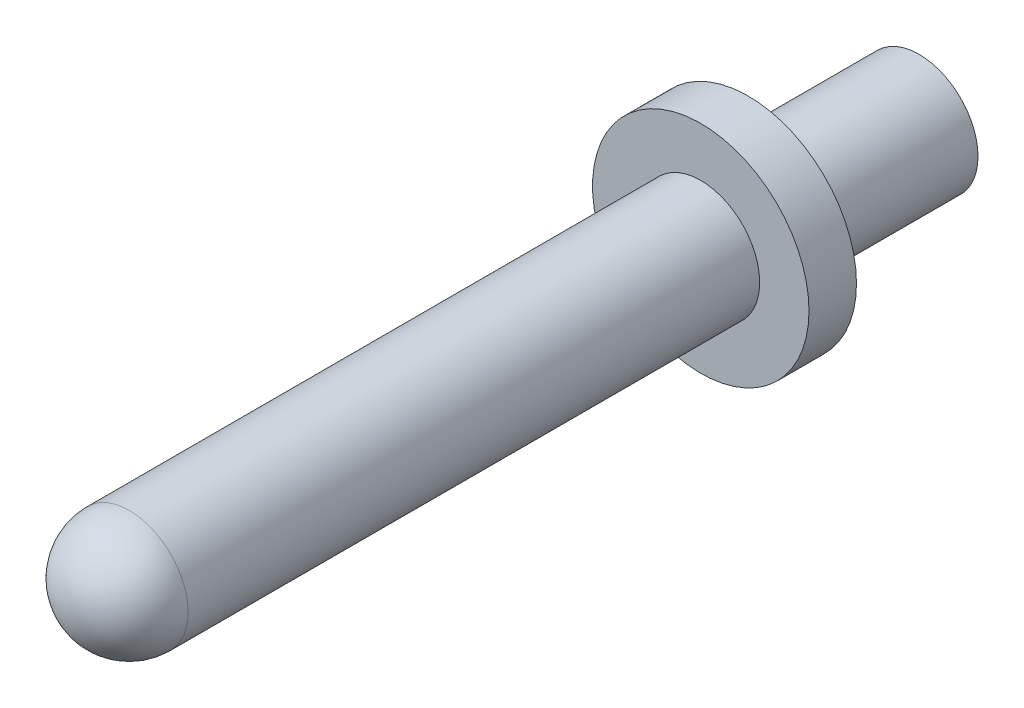
ISO-10303-21;
HEADER;
FILE_DESCRIPTION(('STEP AP214'),'2;1');
FILE_NAME('part.step','',(''),(''),'','','');
FILE_SCHEMA(('AUTOMOTIVE_DESIGN { 1 0 10303 214 1 1 1 1 }'));
ENDSEC;
DATA;
#1=APPLICATION_CONTEXT('core data for automotive mechanical design processes');
#2=APPLICATION_PROTOCOL_DEFINITION('international standard','automotive_design',2000,#1);
#3=PRODUCT_CONTEXT('',#1,'mechanical');
#4=PRODUCT('Part','Part','',(#3));
#5=PRODUCT_RELATED_PRODUCT_CATEGORY('part','',(#4));
#6=PRODUCT_DEFINITION_FORMATION('','',#4);
#7=PRODUCT_DEFINITION_CONTEXT('part definition',#1,'design');
#8=PRODUCT_DEFINITION('design','',#6,#7);
#9=PRODUCT_DEFINITION_SHAPE('','',#8);
#10=(LENGTH_UNIT() NAMED_UNIT(*) SI_UNIT(.MILLI.,.METRE.));
#11=(NAMED_UNIT(*) PLANE_ANGLE_UNIT() SI_UNIT($,.RADIAN.));
#12=(NAMED_UNIT(*) SI_UNIT($,.STERADIAN.) SOLID_ANGLE_UNIT());
#13=UNCERTAINTY_MEASURE_WITH_UNIT(LENGTH_MEASURE(1.E-05),#10,'distance_accuracy_value','');
#14=(GEOMETRIC_REPRESENTATION_CONTEXT(3) GLOBAL_UNCERTAINTY_ASSIGNED_CONTEXT((#13)) GLOBAL_UNIT_ASSIGNED_CONTEXT((#10,
#11,#12)) REPRESENTATION_CONTEXT('',''));
#15=CARTESIAN_POINT('',(0.,0.,0.));
#16=DIRECTION('',(0.,0.,1.));
#17=DIRECTION('',(1.,0.,0.));
#18=AXIS2_PLACEMENT_3D('',#15,#16,#17);
#19=CARTESIAN_POINT('',(0.,0.,-0.787400000000001));
#20=DIRECTION('',(0.,0.,1.));
#21=DIRECTION('',(-1.,0.,0.));
#22=AXIS2_PLACEMENT_3D('',#19,#20,#21);
#23=SPHERICAL_SURFACE('',#22,0.787400000000001);
#24=CARTESIAN_POINT('',(0.,0.,-0.787400000000001));
#25=DIRECTION('',(0.,0.,1.));
#26=DIRECTION('',(1.,0.,0.));
#27=AXIS2_PLACEMENT_3D('',#24,#25,#26);
#28=CIRCLE('',#27,0.787400000000001);
#29=CARTESIAN_POINT('',(0.787400000000001,0.,-0.787400000000001));
#30=VERTEX_POINT('',#29);
#31=EDGE_CURVE('E11',#30,#30,#28,.T.);
#32=ORIENTED_EDGE('',*,*,#31,.T.);
#33=EDGE_LOOP('',(#32));
#34=FACE_BOUND('',#33,.T.);
#35=ADVANCED_FACE('F35',(#34),#23,.T.);
#36=CARTESIAN_POINT('',(0.,0.,0.));
#37=DIRECTION('',(0.,0.,1.));
#38=DIRECTION('',(1.,0.,0.));
#39=AXIS2_PLACEMENT_3D('',#36,#37,#38);
#40=CYLINDRICAL_SURFACE('',#39,0.787400000000001);
#41=CARTESIAN_POINT('',(0.,0.,-8.43280000000002));
#42=DIRECTION('',(0.,0.,1.));
#43=DIRECTION('',(1.,0.,0.));
#44=AXIS2_PLACEMENT_3D('',#41,#42,#43);
#45=CIRCLE('',#44,0.787400000000001);
#46=CARTESIAN_POINT('',(0.787400000000001,0.,-8.43280000000002));
#47=VERTEX_POINT('',#46);
#48=EDGE_CURVE('E41',#47,#47,#45,.T.);
#49=ORIENTED_EDGE('',*,*,#48,.T.);
#50=EDGE_LOOP('',(#49));
#51=FACE_BOUND('',#50,.T.);
#52=ORIENTED_EDGE('',*,*,#31,.F.);
#53=EDGE_LOOP('',(#52));
#54=FACE_BOUND('',#53,.T.);
#55=ADVANCED_FACE('F72',(#51,#54),#40,.T.);
#56=CARTESIAN_POINT('',(0.,0.,-8.43280000000002));
#57=DIRECTION('',(0.,0.,1.));
#58=DIRECTION('',(1.,0.,0.));
#59=AXIS2_PLACEMENT_3D('',#56,#57,#58);
#60=PLANE('',#59);
#61=CARTESIAN_POINT('',(0.,0.,-8.43280000000002));
#62=DIRECTION('',(0.,0.,1.));
#63=DIRECTION('',(1.,0.,0.));
#64=AXIS2_PLACEMENT_3D('',#61,#62,#63);
#65=CIRCLE('',#64,1.4478);
#66=CARTESIAN_POINT('',(1.4478,0.,-8.43280000000002));
#67=VERTEX_POINT('',#66);
#68=EDGE_CURVE('E67',#67,#67,#65,.T.);
#69=ORIENTED_EDGE('',*,*,#68,.T.);
#70=EDGE_LOOP('',(#69));
#71=FACE_BOUND('',#70,.T.);
#72=ORIENTED_EDGE('',*,*,#48,.F.);
#73=EDGE_LOOP('',(#72));
#74=FACE_BOUND('',#73,.T.);
#75=ADVANCED_FACE('F75',(#71,#74),#60,.T.);
#76=CARTESIAN_POINT('',(0.,0.,0.));
#77=DIRECTION('',(0.,0.,1.));
#78=DIRECTION('',(1.,0.,0.));
#79=AXIS2_PLACEMENT_3D('',#76,#77,#78);
#80=CYLINDRICAL_SURFACE('',#79,1.4478);
#81=CARTESIAN_POINT('',(0.,0.,-9.06780000000001));
#82=DIRECTION('',(0.,0.,1.));
#83=DIRECTION('',(1.,0.,0.));
#84=AXIS2_PLACEMENT_3D('',#81,#82,#83);
#85=CIRCLE('',#84,1.4478);
#86=CARTESIAN_POINT('',(1.4478,0.,-9.06780000000001));
#87=VERTEX_POINT('',#86);
#88=EDGE_CURVE('E64',#87,#87,#85,.T.);
#89=ORIENTED_EDGE('',*,*,#88,.T.);
#90=EDGE_LOOP('',(#89));
#91=FACE_BOUND('',#90,.T.);
#92=ORIENTED_EDGE('',*,*,#68,.F.);
#93=EDGE_LOOP('',(#92));
#94=FACE_BOUND('',#93,.T.);
#95=ADVANCED_FACE('F77',(#91,#94),#80,.T.);
#96=CARTESIAN_POINT('',(0.,0.,-9.06780000000001));
#97=DIRECTION('',(0.,0.,1.));
#98=DIRECTION('',(1.,0.,0.));
#99=AXIS2_PLACEMENT_3D('',#96,#97,#98);
#100=PLANE('',#99);
#101=ORIENTED_EDGE('',*,*,#88,.F.);
#102=EDGE_LOOP('',(#101));
#103=FACE_BOUND('',#102,.T.);
#104=CARTESIAN_POINT('',(0.,0.,-9.06780000000001));
#105=DIRECTION('',(0.,0.,1.));
#106=DIRECTION('',(1.,0.,0.));
#107=AXIS2_PLACEMENT_3D('',#104,#105,#106);
#108=CIRCLE('',#107,0.787400000000001);
#109=CARTESIAN_POINT('',(0.787400000000001,0.,-9.06780000000001));
#110=VERTEX_POINT('',#109);
#111=EDGE_CURVE('E61',#110,#110,#108,.T.);
#112=ORIENTED_EDGE('',*,*,#111,.T.);
#113=EDGE_LOOP('',(#112));
#114=FACE_BOUND('',#113,.T.);
#115=ADVANCED_FACE('F84',(#103,#114),#100,.F.);
#116=CARTESIAN_POINT('',(0.,0.,0.));
#117=DIRECTION('',(0.,0.,1.));
#118=DIRECTION('',(1.,0.,0.));
#119=AXIS2_PLACEMENT_3D('',#116,#117,#118);
#120=CYLINDRICAL_SURFACE('',#119,0.787400000000001);
#121=CARTESIAN_POINT('',(0.,0.,-11.3538));
#122=DIRECTION('',(0.,0.,1.));
#123=DIRECTION('',(1.,0.,0.));
#124=AXIS2_PLACEMENT_3D('',#121,#122,#123);
#125=CIRCLE('',#124,0.787400000000001);
#126=CARTESIAN_POINT('',(0.787400000000001,0.,-11.3538));
#127=VERTEX_POINT('',#126);
#128=EDGE_CURVE('E56',#127,#127,#125,.T.);
#129=ORIENTED_EDGE('',*,*,#128,.T.);
#130=EDGE_LOOP('',(#129));
#131=FACE_BOUND('',#130,.T.);
#132=ORIENTED_EDGE('',*,*,#111,.F.);
#133=EDGE_LOOP('',(#132));
#134=FACE_BOUND('',#133,.T.);
#135=ADVANCED_FACE('F117',(#131,#134),#120,.T.);
#136=CARTESIAN_POINT('',(0.,0.,-11.3538));
#137=DIRECTION('',(0.,0.,1.));
#138=DIRECTION('',(1.,0.,0.));
#139=AXIS2_PLACEMENT_3D('',#136,#137,#138);
#140=PLANE('',#139);
#141=ORIENTED_EDGE('',*,*,#128,.F.);
#142=EDGE_LOOP('',(#141));
#143=FACE_BOUND('',#142,.T.);
#144=CARTESIAN_POINT('',(0.,0.,-11.3538));
#145=DIRECTION('',(0.,0.,1.));
#146=DIRECTION('',(1.,0.,0.));
#147=AXIS2_PLACEMENT_3D('',#144,#145,#146);
#148=CIRCLE('',#147,0.546100000000001);
#149=CARTESIAN_POINT('',(0.546100000000001,0.,-11.3538));
#150=VERTEX_POINT('',#149);
#151=EDGE_CURVE('E53',#150,#150,#148,.T.);
#152=ORIENTED_EDGE('',*,*,#151,.T.);
#153=EDGE_LOOP('',(#152));
#154=FACE_BOUND('',#153,.T.);
#155=ADVANCED_FACE('F127',(#143,#154),#140,.F.);
#156=CARTESIAN_POINT('',(0.,0.,0.));
#157=DIRECTION('',(0.,0.,1.));
#158=DIRECTION('',(1.,0.,0.));
#159=AXIS2_PLACEMENT_3D('',#156,#157,#158);
#160=CYLINDRICAL_SURFACE('',#159,0.546100000000001);
#161=ORIENTED_EDGE('',*,*,#151,.F.);
#162=EDGE_LOOP('',(#161));
#163=FACE_BOUND('',#162,.T.);
#164=CARTESIAN_POINT('',(0.,0.,-9.06780000000001));
#165=DIRECTION('',(0.,0.,1.));
#166=DIRECTION('',(1.,0.,0.));
#167=AXIS2_PLACEMENT_3D('',#164,#165,#166);
#168=CIRCLE('',#167,0.546100000000001);
#169=CARTESIAN_POINT('',(0.546100000000001,0.,-9.06780000000001));
#170=VERTEX_POINT('',#169);
#171=EDGE_CURVE('E51',#170,#170,#168,.T.);
#172=ORIENTED_EDGE('',*,*,#171,.T.);
#173=EDGE_LOOP('',(#172));
#174=FACE_BOUND('',#173,.T.);
#175=ADVANCED_FACE('F47',(#163,#174),#160,.F.);
#176=CARTESIAN_POINT('',(0.,0.,-9.06780000000001));
#177=DIRECTION('',(0.,0.,-1.));
#178=DIRECTION('',(-1.,0.,0.));
#179=AXIS2_PLACEMENT_3D('',#176,#177,#178);
#180=CONICAL_SURFACE('',#179,0.546100000000001,1.04416905536119);
#181=CARTESIAN_POINT('',(0.,0.,-8.75030000000004));
#182=VERTEX_POINT('',#181);
#183=VERTEX_LOOP('',#182);
#184=FACE_BOUND('',#183,.T.);
#185=ORIENTED_EDGE('',*,*,#171,.F.);
#186=EDGE_LOOP('',(#185));
#187=FACE_BOUND('',#186,.T.);
#188=ADVANCED_FACE('F44',(#184,#187),#180,.F.);
#189=CLOSED_SHELL('',(#35,#55,#75,#95,#115,#135,#155,#175,#188));
#190=MANIFOLD_SOLID_BREP('B2',#189);
#191=ADVANCED_BREP_SHAPE_REPRESENTATION('',(#18,#190),#14);
#192=SHAPE_DEFINITION_REPRESENTATION(#9,#191);
ENDSEC;
END-ISO-10303-21;
